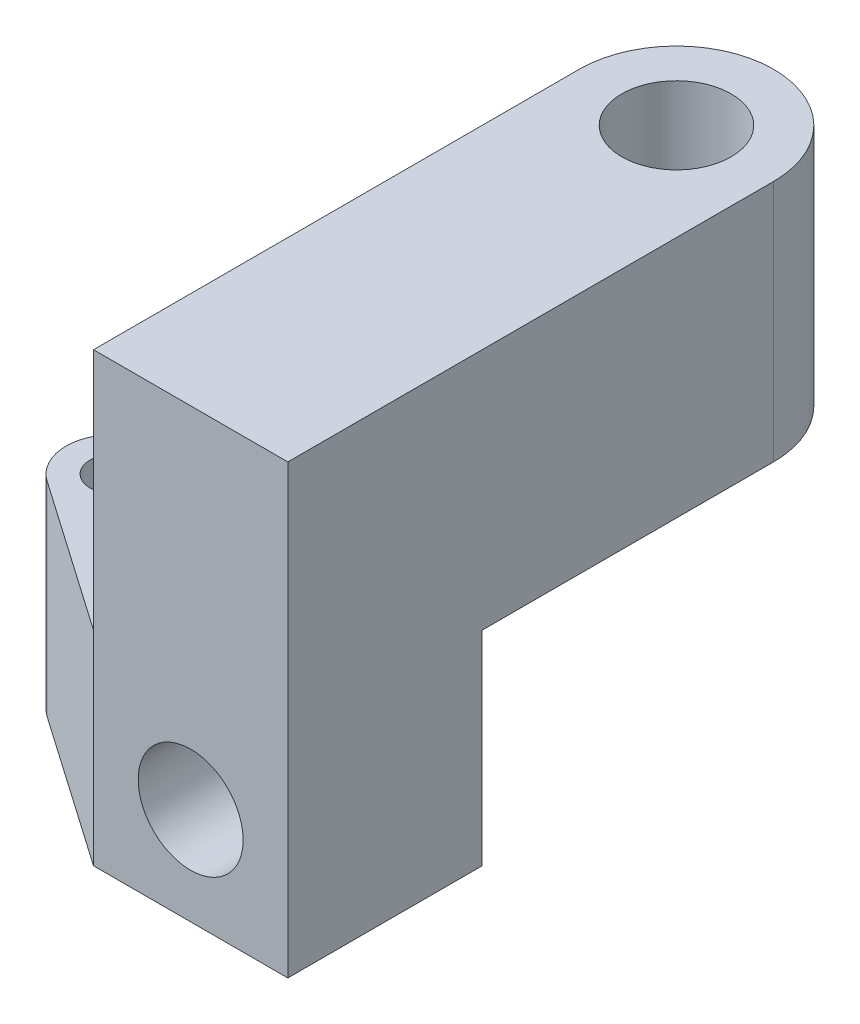
ISO-10303-21;
HEADER;
FILE_DESCRIPTION(('STEP AP214'),'2;1');
FILE_NAME('part.step','',(''),(''),'','','');
FILE_SCHEMA(('AUTOMOTIVE_DESIGN { 1 0 10303 214 1 1 1 1 }'));
ENDSEC;
DATA;
#1=APPLICATION_CONTEXT('core data for automotive mechanical design processes');
#2=APPLICATION_PROTOCOL_DEFINITION('international standard','automotive_design',2000,#1);
#3=PRODUCT_CONTEXT('',#1,'mechanical');
#4=PRODUCT('Part','Part','',(#3));
#5=PRODUCT_RELATED_PRODUCT_CATEGORY('part','',(#4));
#6=PRODUCT_DEFINITION_FORMATION('','',#4);
#7=PRODUCT_DEFINITION_CONTEXT('part definition',#1,'design');
#8=PRODUCT_DEFINITION('design','',#6,#7);
#9=PRODUCT_DEFINITION_SHAPE('','',#8);
#10=(LENGTH_UNIT() NAMED_UNIT(*) SI_UNIT(.MILLI.,.METRE.));
#11=(NAMED_UNIT(*) PLANE_ANGLE_UNIT() SI_UNIT($,.RADIAN.));
#12=(NAMED_UNIT(*) SI_UNIT($,.STERADIAN.) SOLID_ANGLE_UNIT());
#13=UNCERTAINTY_MEASURE_WITH_UNIT(LENGTH_MEASURE(1.E-05),#10,'distance_accuracy_value','');
#14=(GEOMETRIC_REPRESENTATION_CONTEXT(3) GLOBAL_UNCERTAINTY_ASSIGNED_CONTEXT((#13)) GLOBAL_UNIT_ASSIGNED_CONTEXT((#10,
#11,#12)) REPRESENTATION_CONTEXT('',''));
#15=CARTESIAN_POINT('',(0.,0.,0.));
#16=DIRECTION('',(0.,0.,1.));
#17=DIRECTION('',(1.,0.,0.));
#18=AXIS2_PLACEMENT_3D('',#15,#16,#17);
#19=CARTESIAN_POINT('',(0.,0.,-10.5833333333333));
#20=DIRECTION('',(0.,1.,0.));
#21=DIRECTION('',(0.,0.,1.));
#22=AXIS2_PLACEMENT_3D('',#19,#20,#21);
#23=PLANE('',#22);
#24=DIRECTION('',(1.,0.,0.));
#25=VECTOR('',#24,1.);
#26=CARTESIAN_POINT('',(7.15674719237924,0.,8.46666666666666));
#27=LINE('',#26,#25);
#28=CARTESIAN_POINT('',(-14.5060480297225,0.,8.46666666666666));
#29=VERTEX_POINT('',#28);
#30=CARTESIAN_POINT('',(-2.30357135769656,0.,8.46666666666667));
#31=VERTEX_POINT('',#30);
#32=EDGE_CURVE('E173',#29,#31,#27,.T.);
#33=ORIENTED_EDGE('',*,*,#32,.T.);
#34=DIRECTION('',(0.,0.,1.));
#35=VECTOR('',#34,1.);
#36=CARTESIAN_POINT('',(-2.30357135769656,0.,8.46666666666667));
#37=LINE('',#36,#35);
#38=CARTESIAN_POINT('',(-2.30357135769657,0.,8.47193613753268));
#39=VERTEX_POINT('',#38);
#40=EDGE_CURVE('E159',#31,#39,#37,.T.);
#41=ORIENTED_EDGE('',*,*,#40,.T.);
#42=DIRECTION('',(0.999999814598544,0.,-0.000608935856796453));
#43=VECTOR('',#42,1.);
#44=CARTESIAN_POINT('',(6.35,0.,8.46666666666666));
#45=LINE('',#44,#43);
#46=CARTESIAN_POINT('',(-14.5060480297225,0.,8.47936666449763));
#47=VERTEX_POINT('',#46);
#48=EDGE_CURVE('E499',#47,#39,#45,.T.);
#49=ORIENTED_EDGE('',*,*,#48,.F.);
#50=DIRECTION('',(0.,0.,-1.));
#51=VECTOR('',#50,1.);
#52=CARTESIAN_POINT('',(-14.5060480297225,0.,-10.5833333333333));
#53=LINE('',#52,#51);
#54=EDGE_CURVE('E180',#47,#29,#53,.T.);
#55=ORIENTED_EDGE('',*,*,#54,.T.);
#56=EDGE_LOOP('',(#33,#41,#49,#55));
#57=FACE_BOUND('',#56,.T.);
#58=ADVANCED_FACE('F71',(#57),#23,.F.);
#59=CARTESIAN_POINT('',(2.30357135769656,0.,8.46913068261576));
#60=VERTEX_POINT('',#59);
#61=CARTESIAN_POINT('',(6.35,0.,8.46666666666666));
#62=VERTEX_POINT('',#61);
#63=EDGE_CURVE('E537',#60,#62,#45,.T.);
#64=ORIENTED_EDGE('',*,*,#63,.F.);
#65=DIRECTION('',(0.,0.,1.));
#66=VECTOR('',#65,1.);
#67=CARTESIAN_POINT('',(2.30357135769656,0.,8.46666666666667));
#68=LINE('',#67,#66);
#69=CARTESIAN_POINT('',(2.30357135769656,0.,8.46666666666667));
#70=VERTEX_POINT('',#69);
#71=EDGE_CURVE('E86',#60,#70,#68,.F.);
#72=ORIENTED_EDGE('',*,*,#71,.T.);
#73=EDGE_CURVE('E175',#70,#62,#27,.T.);
#74=ORIENTED_EDGE('',*,*,#73,.T.);
#75=EDGE_LOOP('',(#64,#72,#74));
#76=FACE_BOUND('',#75,.T.);
#77=ADVANCED_FACE('F241',(#76),#23,.F.);
#78=CARTESIAN_POINT('',(-6.35,25.4,21.1666666666667));
#79=DIRECTION('',(-1.,0.,0.));
#80=DIRECTION('',(0.,0.,1.));
#81=AXIS2_PLACEMENT_3D('',#78,#79,#80);
#82=PLANE('',#81);
#83=DIRECTION('',(0.,0.,1.));
#84=VECTOR('',#83,1.);
#85=CARTESIAN_POINT('',(-6.35,9.525,0.));
#86=LINE('',#85,#84);
#87=CARTESIAN_POINT('',(-6.35,9.525,8.46666666666666));
#88=VERTEX_POINT('',#87);
#89=CARTESIAN_POINT('',(-6.35,9.525,21.1666666666667));
#90=VERTEX_POINT('',#89);
#91=EDGE_CURVE('E476',#88,#90,#86,.T.);
#92=ORIENTED_EDGE('',*,*,#91,.T.);
#93=DIRECTION('',(0.,-1.,0.));
#94=VECTOR('',#93,1.);
#95=CARTESIAN_POINT('',(-6.35,25.4,21.1666666666667));
#96=LINE('',#95,#94);
#97=CARTESIAN_POINT('',(-6.35,25.4,21.1666666666667));
#98=VERTEX_POINT('',#97);
#99=EDGE_CURVE('E203',#98,#90,#96,.T.);
#100=ORIENTED_EDGE('',*,*,#99,.F.);
#101=DIRECTION('',(0.,0.,-1.));
#102=VECTOR('',#101,1.);
#103=CARTESIAN_POINT('',(-6.35,25.4,21.1666666666667));
#104=LINE('',#103,#102);
#105=CARTESIAN_POINT('',(-6.35,25.4,-10.5833333333333));
#106=VERTEX_POINT('',#105);
#107=EDGE_CURVE('E197',#98,#106,#104,.T.);
#108=ORIENTED_EDGE('',*,*,#107,.T.);
#109=DIRECTION('',(0.,-1.,0.));
#110=VECTOR('',#109,1.);
#111=CARTESIAN_POINT('',(-6.35,25.4,-10.5833333333333));
#112=LINE('',#111,#110);
#113=CARTESIAN_POINT('',(-6.35,9.525,-10.5833333333333));
#114=VERTEX_POINT('',#113);
#115=EDGE_CURVE('E206',#106,#114,#112,.T.);
#116=ORIENTED_EDGE('',*,*,#115,.T.);
#117=DIRECTION('',(0.,0.,1.));
#118=VECTOR('',#117,1.);
#119=CARTESIAN_POINT('',(-6.35,9.525,21.1666666666667));
#120=LINE('',#119,#118);
#121=EDGE_CURVE('E181',#114,#88,#120,.T.);
#122=ORIENTED_EDGE('',*,*,#121,.T.);
#123=EDGE_LOOP('',(#92,#100,#108,#116,#122));
#124=FACE_BOUND('',#123,.T.);
#125=ADVANCED_FACE('F226',(#124),#82,.T.);
#126=CARTESIAN_POINT('',(-6.35,25.4,21.1666666666667));
#127=DIRECTION('',(0.,0.,-1.));
#128=DIRECTION('',(-1.,0.,0.));
#129=AXIS2_PLACEMENT_3D('',#126,#127,#128);
#130=PLANE('',#129);
#131=CARTESIAN_POINT('',(0.,2.54,21.1666666666667));
#132=DIRECTION('',(0.,0.,1.));
#133=DIRECTION('',(1.,0.,0.));
#134=AXIS2_PLACEMENT_3D('',#131,#132,#133);
#135=CIRCLE('',#134,3.429);
#136=CARTESIAN_POINT('',(3.429,2.54,21.1666666666667));
#137=VERTEX_POINT('',#136);
#138=EDGE_CURVE('E176',#137,#137,#135,.T.);
#139=ORIENTED_EDGE('',*,*,#138,.F.);
#140=EDGE_LOOP('',(#139));
#141=FACE_BOUND('',#140,.T.);
#142=ORIENTED_EDGE('',*,*,#99,.T.);
#143=DIRECTION('',(0.,1.,0.));
#144=VECTOR('',#143,1.);
#145=CARTESIAN_POINT('',(-6.35,-6.35,21.1666666666667));
#146=LINE('',#145,#144);
#147=CARTESIAN_POINT('',(-6.35,-3.81,21.1666666666667));
#148=VERTEX_POINT('',#147);
#149=EDGE_CURVE('E511',#148,#90,#146,.T.);
#150=ORIENTED_EDGE('',*,*,#149,.F.);
#151=DIRECTION('',(-1.,0.,0.));
#152=VECTOR('',#151,1.);
#153=CARTESIAN_POINT('',(-6.35,-3.81,21.1666666666667));
#154=LINE('',#153,#152);
#155=CARTESIAN_POINT('',(6.35,-3.81,21.1666666666667));
#156=VERTEX_POINT('',#155);
#157=EDGE_CURVE('E491',#156,#148,#154,.T.);
#158=ORIENTED_EDGE('',*,*,#157,.F.);
#159=DIRECTION('',(0.,-1.,0.));
#160=VECTOR('',#159,1.);
#161=CARTESIAN_POINT('',(6.35,25.4,21.1666666666667));
#162=LINE('',#161,#160);
#163=CARTESIAN_POINT('',(6.35,25.4,21.1666666666667));
#164=VERTEX_POINT('',#163);
#165=EDGE_CURVE('E201',#164,#156,#162,.T.);
#166=ORIENTED_EDGE('',*,*,#165,.F.);
#167=DIRECTION('',(1.,0.,0.));
#168=VECTOR('',#167,1.);
#169=CARTESIAN_POINT('',(-6.35,25.4,21.1666666666667));
#170=LINE('',#169,#168);
#171=EDGE_CURVE('E93',#98,#164,#170,.T.);
#172=ORIENTED_EDGE('',*,*,#171,.F.);
#173=EDGE_LOOP('',(#142,#150,#158,#166,#172));
#174=FACE_BOUND('',#173,.T.);
#175=ADVANCED_FACE('F248',(#141,#174),#130,.F.);
#176=CARTESIAN_POINT('',(0.,0.,8.46666666666666));
#177=DIRECTION('',(0.,0.,1.));
#178=DIRECTION('',(1.,0.,0.));
#179=AXIS2_PLACEMENT_3D('',#176,#177,#178);
#180=PLANE('',#179);
#181=ORIENTED_EDGE('',*,*,#73,.F.);
#182=CARTESIAN_POINT('',(0.,2.54,8.46666666666667));
#183=DIRECTION('',(0.,0.,1.));
#184=DIRECTION('',(1.,0.,0.));
#185=AXIS2_PLACEMENT_3D('',#182,#183,#184);
#186=CIRCLE('',#185,3.429);
#187=EDGE_CURVE('E162',#70,#31,#186,.T.);
#188=ORIENTED_EDGE('',*,*,#187,.T.);
#189=ORIENTED_EDGE('',*,*,#32,.F.);
#190=DIRECTION('',(0.,1.,0.));
#191=VECTOR('',#190,1.);
#192=CARTESIAN_POINT('',(-14.5060480297225,-6.35,8.46666666666666));
#193=LINE('',#192,#191);
#194=CARTESIAN_POINT('',(-14.5060480297225,9.525,8.46666666666666));
#195=VERTEX_POINT('',#194);
#196=EDGE_CURVE('E478',#29,#195,#193,.T.);
#197=ORIENTED_EDGE('',*,*,#196,.T.);
#198=DIRECTION('',(1.,0.,0.));
#199=VECTOR('',#198,1.);
#200=CARTESIAN_POINT('',(0.,9.525,8.46666666666666));
#201=LINE('',#200,#199);
#202=EDGE_CURVE('E482',#195,#88,#201,.T.);
#203=ORIENTED_EDGE('',*,*,#202,.T.);
#204=DIRECTION('',(-1.,0.,0.));
#205=VECTOR('',#204,1.);
#206=CARTESIAN_POINT('',(7.15674719237924,9.525,8.46666666666666));
#207=LINE('',#206,#205);
#208=CARTESIAN_POINT('',(6.35,9.525,8.46666666666666));
#209=VERTEX_POINT('',#208);
#210=EDGE_CURVE('E186',#209,#88,#207,.T.);
#211=ORIENTED_EDGE('',*,*,#210,.F.);
#212=DIRECTION('',(0.,-1.,0.));
#213=VECTOR('',#212,1.);
#214=CARTESIAN_POINT('',(6.35,0.,8.46666666666666));
#215=LINE('',#214,#213);
#216=EDGE_CURVE('E219',#209,#62,#215,.T.);
#217=ORIENTED_EDGE('',*,*,#216,.T.);
#218=EDGE_LOOP('',(#181,#188,#189,#197,#203,#211,#217));
#219=FACE_BOUND('',#218,.T.);
#220=ADVANCED_FACE('F171',(#219),#180,.F.);
#221=CARTESIAN_POINT('',(6.35,25.4,21.1666666666667));
#222=DIRECTION('',(-1.,0.,0.));
#223=DIRECTION('',(0.,0.,1.));
#224=AXIS2_PLACEMENT_3D('',#221,#222,#223);
#225=PLANE('',#224);
#226=ORIENTED_EDGE('',*,*,#165,.T.);
#227=DIRECTION('',(0.,0.,1.));
#228=VECTOR('',#227,1.);
#229=CARTESIAN_POINT('',(6.35,-3.81,21.1666666666667));
#230=LINE('',#229,#228);
#231=CARTESIAN_POINT('',(6.35,-3.81,8.46666666666666));
#232=VERTEX_POINT('',#231);
#233=EDGE_CURVE('E487',#232,#156,#230,.T.);
#234=ORIENTED_EDGE('',*,*,#233,.F.);
#235=DIRECTION('',(0.,1.,0.));
#236=VECTOR('',#235,1.);
#237=CARTESIAN_POINT('',(6.35,-3.81,8.46666666666666));
#238=LINE('',#237,#236);
#239=EDGE_CURVE('E485',#232,#62,#238,.T.);
#240=ORIENTED_EDGE('',*,*,#239,.T.);
#241=ORIENTED_EDGE('',*,*,#216,.F.);
#242=DIRECTION('',(0.,0.,1.));
#243=VECTOR('',#242,1.);
#244=CARTESIAN_POINT('',(6.35,9.525,21.1666666666667));
#245=LINE('',#244,#243);
#246=CARTESIAN_POINT('',(6.35,9.525,-10.5833333333333));
#247=VERTEX_POINT('',#246);
#248=EDGE_CURVE('E191',#247,#209,#245,.T.);
#249=ORIENTED_EDGE('',*,*,#248,.F.);
#250=DIRECTION('',(0.,-1.,0.));
#251=VECTOR('',#250,1.);
#252=CARTESIAN_POINT('',(6.35,25.4,-10.5833333333333));
#253=LINE('',#252,#251);
#254=CARTESIAN_POINT('',(6.35,25.4,-10.5833333333333));
#255=VERTEX_POINT('',#254);
#256=EDGE_CURVE('E79',#255,#247,#253,.T.);
#257=ORIENTED_EDGE('',*,*,#256,.F.);
#258=DIRECTION('',(0.,0.,-1.));
#259=VECTOR('',#258,1.);
#260=CARTESIAN_POINT('',(6.35,25.4,21.1666666666667));
#261=LINE('',#260,#259);
#262=EDGE_CURVE('E193',#164,#255,#261,.T.);
#263=ORIENTED_EDGE('',*,*,#262,.F.);
#264=EDGE_LOOP('',(#226,#234,#240,#241,#249,#257,#263));
#265=FACE_BOUND('',#264,.T.);
#266=ADVANCED_FACE('F73',(#265),#225,.F.);
#267=CARTESIAN_POINT('',(0.,25.4,-10.5833333333333));
#268=DIRECTION('',(0.,-1.,0.));
#269=DIRECTION('',(0.,0.,-1.));
#270=AXIS2_PLACEMENT_3D('',#267,#268,#269);
#271=CYLINDRICAL_SURFACE('',#270,6.35);
#272=CARTESIAN_POINT('',(0.,9.525,-10.5833333333333));
#273=DIRECTION('',(0.,-1.,0.));
#274=DIRECTION('',(1.,0.,0.));
#275=AXIS2_PLACEMENT_3D('',#272,#273,#274);
#276=CIRCLE('',#275,6.35);
#277=EDGE_CURVE('E184',#114,#247,#276,.T.);
#278=ORIENTED_EDGE('',*,*,#277,.F.);
#279=ORIENTED_EDGE('',*,*,#115,.F.);
#280=CARTESIAN_POINT('',(0.,25.4,-10.5833333333333));
#281=DIRECTION('',(0.,1.,0.));
#282=DIRECTION('',(0.,0.,1.));
#283=AXIS2_PLACEMENT_3D('',#280,#281,#282);
#284=CIRCLE('',#283,6.35);
#285=EDGE_CURVE('E195',#255,#106,#284,.T.);
#286=ORIENTED_EDGE('',*,*,#285,.F.);
#287=ORIENTED_EDGE('',*,*,#256,.T.);
#288=EDGE_LOOP('',(#278,#279,#286,#287));
#289=FACE_BOUND('',#288,.T.);
#290=ADVANCED_FACE('F211',(#289),#271,.T.);
#291=CARTESIAN_POINT('',(0.,25.4,-10.5833333333333));
#292=DIRECTION('',(0.,1.,0.));
#293=DIRECTION('',(0.,0.,1.));
#294=AXIS2_PLACEMENT_3D('',#291,#292,#293);
#295=PLANE('',#294);
#296=CARTESIAN_POINT('',(0.,25.4,-10.5833333333333));
#297=DIRECTION('',(0.,-1.,0.));
#298=DIRECTION('',(1.,0.,0.));
#299=AXIS2_PLACEMENT_3D('',#296,#297,#298);
#300=CIRCLE('',#299,3.571875);
#301=CARTESIAN_POINT('',(3.571875,25.4,-10.5833333333333));
#302=VERTEX_POINT('',#301);
#303=EDGE_CURVE('E471',#302,#302,#300,.T.);
#304=ORIENTED_EDGE('',*,*,#303,.T.);
#305=EDGE_LOOP('',(#304));
#306=FACE_BOUND('',#305,.T.);
#307=ORIENTED_EDGE('',*,*,#262,.T.);
#308=ORIENTED_EDGE('',*,*,#285,.T.);
#309=ORIENTED_EDGE('',*,*,#107,.F.);
#310=ORIENTED_EDGE('',*,*,#171,.T.);
#311=EDGE_LOOP('',(#307,#308,#309,#310));
#312=FACE_BOUND('',#311,.T.);
#313=ADVANCED_FACE('F227',(#306,#312),#295,.T.);
#314=CARTESIAN_POINT('',(7.15674719237924,9.525,8.46666666666666));
#315=DIRECTION('',(0.,-1.,0.));
#316=DIRECTION('',(1.,0.,0.));
#317=AXIS2_PLACEMENT_3D('',#314,#315,#316);
#318=PLANE('',#317);
#319=CARTESIAN_POINT('',(0.,9.525,-10.5833333333333));
#320=DIRECTION('',(0.,-1.,0.));
#321=DIRECTION('',(1.,0.,0.));
#322=AXIS2_PLACEMENT_3D('',#319,#320,#321);
#323=CIRCLE('',#322,3.571875);
#324=CARTESIAN_POINT('',(3.571875,9.525,-10.5833333333333));
#325=VERTEX_POINT('',#324);
#326=EDGE_CURVE('E474',#325,#325,#323,.T.);
#327=ORIENTED_EDGE('',*,*,#326,.F.);
#328=EDGE_LOOP('',(#327));
#329=FACE_BOUND('',#328,.T.);
#330=ORIENTED_EDGE('',*,*,#248,.T.);
#331=ORIENTED_EDGE('',*,*,#210,.T.);
#332=ORIENTED_EDGE('',*,*,#121,.F.);
#333=ORIENTED_EDGE('',*,*,#277,.T.);
#334=EDGE_LOOP('',(#330,#331,#332,#333));
#335=FACE_BOUND('',#334,.T.);
#336=ADVANCED_FACE('F223',(#329,#335),#318,.T.);
#337=CARTESIAN_POINT('',(0.,9.525,0.));
#338=DIRECTION('',(0.,1.,0.));
#339=DIRECTION('',(0.,0.,1.));
#340=AXIS2_PLACEMENT_3D('',#337,#338,#339);
#341=PLANE('',#340);
#342=CARTESIAN_POINT('',(-14.5060480297225,9.525,11.6416666644976));
#343=DIRECTION('',(0.,1.,0.));
#344=DIRECTION('',(0.,0.,1.));
#345=AXIS2_PLACEMENT_3D('',#342,#343,#344);
#346=CIRCLE('',#345,1.58749999792308);
#347=CARTESIAN_POINT('',(-14.5060480297225,9.525,13.2291666624207));
#348=VERTEX_POINT('',#347);
#349=EDGE_CURVE('E494',#348,#348,#346,.T.);
#350=ORIENTED_EDGE('',*,*,#349,.F.);
#351=EDGE_LOOP('',(#350));
#352=FACE_BOUND('',#351,.T.);
#353=DIRECTION('',(0.,0.,-1.));
#354=VECTOR('',#353,1.);
#355=CARTESIAN_POINT('',(-14.5060480297225,9.525,8.46666666666666));
#356=LINE('',#355,#354);
#357=CARTESIAN_POINT('',(-14.5060480297225,9.525,8.47936666449763));
#358=VERTEX_POINT('',#357);
#359=EDGE_CURVE('E509',#358,#195,#356,.T.);
#360=ORIENTED_EDGE('',*,*,#359,.F.);
#361=CARTESIAN_POINT('',(-14.5060480297225,9.525,11.6416666644976));
#362=DIRECTION('',(0.,-1.,0.));
#363=DIRECTION('',(0.,0.,1.));
#364=AXIS2_PLACEMENT_3D('',#361,#362,#363);
#365=CIRCLE('',#364,3.1623);
#366=CARTESIAN_POINT('',(-16.3117525422384,9.525,14.237735327588));
#367=VERTEX_POINT('',#366);
#368=EDGE_CURVE('E506',#367,#358,#365,.T.);
#369=ORIENTED_EDGE('',*,*,#368,.F.);
#370=DIRECTION('',(-0.820943194222667,0.,-0.571009870194452));
#371=VECTOR('',#370,1.);
#372=CARTESIAN_POINT('',(-6.35,9.525,21.1666666666667));
#373=LINE('',#372,#371);
#374=EDGE_CURVE('E503',#90,#367,#373,.T.);
#375=ORIENTED_EDGE('',*,*,#374,.F.);
#376=ORIENTED_EDGE('',*,*,#91,.F.);
#377=ORIENTED_EDGE('',*,*,#202,.F.);
#378=EDGE_LOOP('',(#360,#369,#375,#376,#377));
#379=FACE_BOUND('',#378,.T.);
#380=ADVANCED_FACE('F235',(#352,#379),#341,.T.);
#381=CARTESIAN_POINT('',(0.,25.4,-10.5833333333333));
#382=DIRECTION('',(0.,-1.,0.));
#383=DIRECTION('',(1.,0.,0.));
#384=AXIS2_PLACEMENT_3D('',#381,#382,#383);
#385=CYLINDRICAL_SURFACE('',#384,3.571875);
#386=ORIENTED_EDGE('',*,*,#303,.F.);
#387=EDGE_LOOP('',(#386));
#388=FACE_BOUND('',#387,.T.);
#389=ORIENTED_EDGE('',*,*,#326,.T.);
#390=EDGE_LOOP('',(#389));
#391=FACE_BOUND('',#390,.T.);
#392=ADVANCED_FACE('F262',(#388,#391),#385,.F.);
#393=CARTESIAN_POINT('',(-14.5060480297225,-6.35,8.46666666666666));
#394=DIRECTION('',(1.,0.,0.));
#395=DIRECTION('',(0.,0.,-1.));
#396=AXIS2_PLACEMENT_3D('',#393,#394,#395);
#397=PLANE('',#396);
#398=DIRECTION('',(0.,1.,0.));
#399=VECTOR('',#398,1.);
#400=CARTESIAN_POINT('',(-14.5060480297225,-6.35,8.47936666449763));
#401=LINE('',#400,#399);
#402=EDGE_CURVE('E513',#47,#358,#401,.T.);
#403=ORIENTED_EDGE('',*,*,#402,.T.);
#404=ORIENTED_EDGE('',*,*,#359,.T.);
#405=ORIENTED_EDGE('',*,*,#196,.F.);
#406=ORIENTED_EDGE('',*,*,#54,.F.);
#407=EDGE_LOOP('',(#403,#404,#405,#406));
#408=FACE_BOUND('',#407,.T.);
#409=ADVANCED_FACE('F281',(#408),#397,.F.);
#410=CARTESIAN_POINT('',(-14.5060480297225,-6.35,11.6416666644976));
#411=DIRECTION('',(0.,1.,0.));
#412=DIRECTION('',(0.,0.,1.));
#413=AXIS2_PLACEMENT_3D('',#410,#411,#412);
#414=CYLINDRICAL_SURFACE('',#413,3.1623);
#415=DIRECTION('',(0.,1.,0.));
#416=VECTOR('',#415,1.);
#417=CARTESIAN_POINT('',(-16.3117525422384,-6.35,14.237735327588));
#418=LINE('',#417,#416);
#419=CARTESIAN_POINT('',(-16.3117525422384,-3.81,14.237735327588));
#420=VERTEX_POINT('',#419);
#421=EDGE_CURVE('E515',#420,#367,#418,.T.);
#422=ORIENTED_EDGE('',*,*,#421,.T.);
#423=ORIENTED_EDGE('',*,*,#368,.T.);
#424=ORIENTED_EDGE('',*,*,#402,.F.);
#425=DIRECTION('',(0.,1.,0.));
#426=VECTOR('',#425,1.);
#427=CARTESIAN_POINT('',(-14.5060480297225,-3.81,8.47936666449763));
#428=LINE('',#427,#426);
#429=CARTESIAN_POINT('',(-14.5060480297225,-3.81,8.47936666449763));
#430=VERTEX_POINT('',#429);
#431=EDGE_CURVE('E490',#430,#47,#428,.T.);
#432=ORIENTED_EDGE('',*,*,#431,.F.);
#433=CARTESIAN_POINT('',(-14.5060480297225,-3.81,11.6416666644976));
#434=DIRECTION('',(0.,-1.,0.));
#435=DIRECTION('',(0.,0.,-1.));
#436=AXIS2_PLACEMENT_3D('',#433,#434,#435);
#437=CIRCLE('',#436,3.1623);
#438=EDGE_CURVE('E531',#420,#430,#437,.T.);
#439=ORIENTED_EDGE('',*,*,#438,.F.);
#440=EDGE_LOOP('',(#422,#423,#424,#432,#439));
#441=FACE_BOUND('',#440,.T.);
#442=ADVANCED_FACE('F285',(#441),#414,.T.);
#443=CARTESIAN_POINT('',(-6.35,-6.35,21.1666666666667));
#444=DIRECTION('',(0.571009870194452,0.,-0.820943194222667));
#445=DIRECTION('',(-0.820943194222667,0.,-0.571009870194452));
#446=AXIS2_PLACEMENT_3D('',#443,#444,#445);
#447=PLANE('',#446);
#448=ORIENTED_EDGE('',*,*,#149,.T.);
#449=ORIENTED_EDGE('',*,*,#374,.T.);
#450=ORIENTED_EDGE('',*,*,#421,.F.);
#451=DIRECTION('',(-0.820943194222667,0.,-0.571009870194452));
#452=VECTOR('',#451,1.);
#453=CARTESIAN_POINT('',(-6.35,-3.81,21.1666666666667));
#454=LINE('',#453,#452);
#455=EDGE_CURVE('E521',#148,#420,#454,.T.);
#456=ORIENTED_EDGE('',*,*,#455,.F.);
#457=EDGE_LOOP('',(#448,#449,#450,#456));
#458=FACE_BOUND('',#457,.T.);
#459=ADVANCED_FACE('F294',(#458),#447,.F.);
#460=CARTESIAN_POINT('',(-14.5060480297225,-6.35,11.6416666644976));
#461=DIRECTION('',(0.,1.,0.));
#462=DIRECTION('',(0.,0.,1.));
#463=AXIS2_PLACEMENT_3D('',#460,#461,#462);
#464=CYLINDRICAL_SURFACE('',#463,1.58749999792308);
#465=ORIENTED_EDGE('',*,*,#349,.T.);
#466=EDGE_LOOP('',(#465));
#467=FACE_BOUND('',#466,.T.);
#468=CARTESIAN_POINT('',(-14.5060480297225,-3.81,11.6416666644976));
#469=DIRECTION('',(0.,-1.,0.));
#470=DIRECTION('',(0.,0.,-1.));
#471=AXIS2_PLACEMENT_3D('',#468,#469,#470);
#472=CIRCLE('',#471,1.58749999792308);
#473=CARTESIAN_POINT('',(-14.5060480297225,-3.81,10.0541666665745));
#474=VERTEX_POINT('',#473);
#475=EDGE_CURVE('E166',#474,#474,#472,.T.);
#476=ORIENTED_EDGE('',*,*,#475,.T.);
#477=EDGE_LOOP('',(#476));
#478=FACE_BOUND('',#477,.T.);
#479=ADVANCED_FACE('F302',(#467,#478),#464,.F.);
#480=CARTESIAN_POINT('',(-14.5060480297225,-3.81,11.6416666644976));
#481=DIRECTION('',(0.,-1.,0.));
#482=DIRECTION('',(0.,0.,-1.));
#483=AXIS2_PLACEMENT_3D('',#480,#481,#482);
#484=PLANE('',#483);
#485=ORIENTED_EDGE('',*,*,#455,.T.);
#486=ORIENTED_EDGE('',*,*,#438,.T.);
#487=DIRECTION('',(0.999999814598544,0.,-0.000608935856796453));
#488=VECTOR('',#487,1.);
#489=CARTESIAN_POINT('',(6.35,-3.81,8.46666666666666));
#490=LINE('',#489,#488);
#491=EDGE_CURVE('E529',#430,#232,#490,.T.);
#492=ORIENTED_EDGE('',*,*,#491,.T.);
#493=ORIENTED_EDGE('',*,*,#233,.T.);
#494=ORIENTED_EDGE('',*,*,#157,.T.);
#495=EDGE_LOOP('',(#485,#486,#492,#493,#494));
#496=FACE_BOUND('',#495,.T.);
#497=ORIENTED_EDGE('',*,*,#475,.F.);
#498=EDGE_LOOP('',(#497));
#499=FACE_BOUND('',#498,.T.);
#500=ADVANCED_FACE('F310',(#496,#499),#484,.T.);
#501=CARTESIAN_POINT('',(6.35,-3.81,8.46666666666666));
#502=DIRECTION('',(0.000608935856796453,0.,0.999999814598544));
#503=DIRECTION('',(0.999999814598544,0.,-0.000608935856796453));
#504=AXIS2_PLACEMENT_3D('',#501,#502,#503);
#505=PLANE('',#504);
#506=ORIENTED_EDGE('',*,*,#48,.T.);
#507=CARTESIAN_POINT('',(0.,2.54,8.47053341007422));
#508=DIRECTION('',(0.000608935856796453,0.,0.999999814598544));
#509=DIRECTION('',(-0.999999814598544,0.,0.000608935856796453));
#510=AXIS2_PLACEMENT_3D('',#507,#508,#509);
#511=ELLIPSE('',#510,3.42900063574171,3.429);
#512=EDGE_CURVE('E12',#39,#60,#511,.T.);
#513=ORIENTED_EDGE('',*,*,#512,.T.);
#514=ORIENTED_EDGE('',*,*,#63,.T.);
#515=ORIENTED_EDGE('',*,*,#239,.F.);
#516=ORIENTED_EDGE('',*,*,#491,.F.);
#517=ORIENTED_EDGE('',*,*,#431,.T.);
#518=EDGE_LOOP('',(#506,#513,#514,#515,#516,#517));
#519=FACE_BOUND('',#518,.T.);
#520=ADVANCED_FACE('F318',(#519),#505,.F.);
#521=CARTESIAN_POINT('',(0.,2.54,8.46666666666667));
#522=DIRECTION('',(0.,0.,1.));
#523=DIRECTION('',(1.,0.,0.));
#524=AXIS2_PLACEMENT_3D('',#521,#522,#523);
#525=CYLINDRICAL_SURFACE('',#524,3.429);
#526=ORIENTED_EDGE('',*,*,#138,.T.);
#527=EDGE_LOOP('',(#526));
#528=FACE_BOUND('',#527,.T.);
#529=ORIENTED_EDGE('',*,*,#187,.F.);
#530=ORIENTED_EDGE('',*,*,#71,.F.);
#531=ORIENTED_EDGE('',*,*,#512,.F.);
#532=ORIENTED_EDGE('',*,*,#40,.F.);
#533=EDGE_LOOP('',(#529,#530,#531,#532));
#534=FACE_BOUND('',#533,.T.);
#535=ADVANCED_FACE('F161',(#528,#534),#525,.F.);
#536=CLOSED_SHELL('',(#58,#77,#125,#175,#220,#266,#290,#313,#336,#380,#392,#409,#442,#459,#479,
#500,#520,#535));
#537=MANIFOLD_SOLID_BREP('B2',#536);
#538=ADVANCED_BREP_SHAPE_REPRESENTATION('',(#18,#537),#14);
#539=SHAPE_DEFINITION_REPRESENTATION(#9,#538);
ENDSEC;
END-ISO-10303-21;
